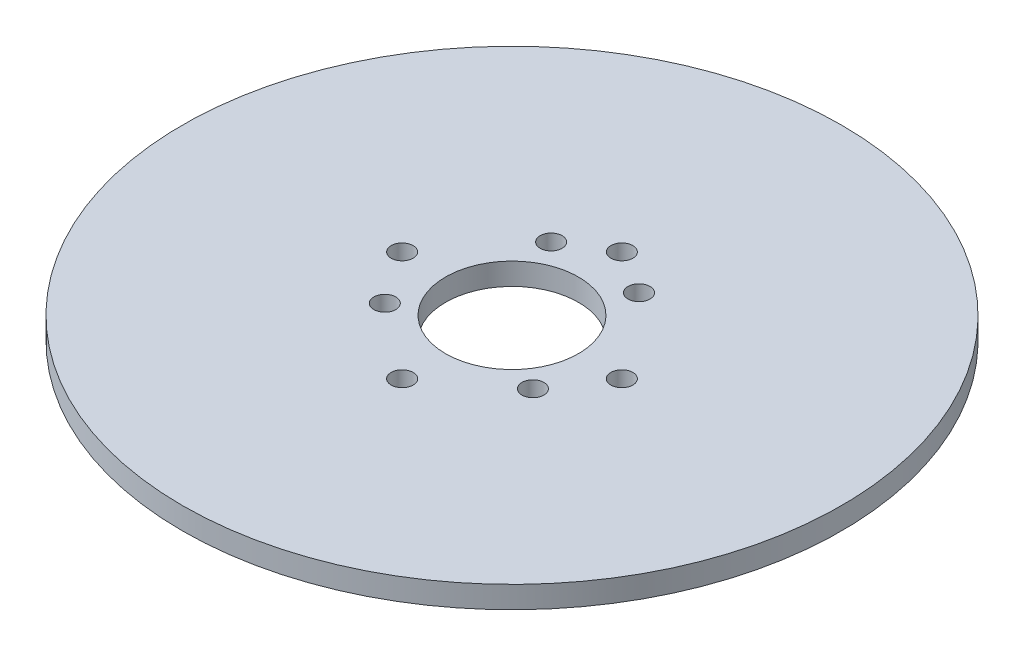
ISO-10303-21;
HEADER;
FILE_DESCRIPTION(('STEP AP214'),'2;1');
FILE_NAME('part.step','',(''),(''),'','','');
FILE_SCHEMA(('AUTOMOTIVE_DESIGN { 1 0 10303 214 1 1 1 1 }'));
ENDSEC;
DATA;
#1=APPLICATION_CONTEXT('core data for automotive mechanical design processes');
#2=APPLICATION_PROTOCOL_DEFINITION('international standard','automotive_design',2000,#1);
#3=PRODUCT_CONTEXT('',#1,'mechanical');
#4=PRODUCT('Part','Part','',(#3));
#5=PRODUCT_RELATED_PRODUCT_CATEGORY('part','',(#4));
#6=PRODUCT_DEFINITION_FORMATION('','',#4);
#7=PRODUCT_DEFINITION_CONTEXT('part definition',#1,'design');
#8=PRODUCT_DEFINITION('design','',#6,#7);
#9=PRODUCT_DEFINITION_SHAPE('','',#8);
#10=(LENGTH_UNIT() NAMED_UNIT(*) SI_UNIT(.MILLI.,.METRE.));
#11=(NAMED_UNIT(*) PLANE_ANGLE_UNIT() SI_UNIT($,.RADIAN.));
#12=(NAMED_UNIT(*) SI_UNIT($,.STERADIAN.) SOLID_ANGLE_UNIT());
#13=UNCERTAINTY_MEASURE_WITH_UNIT(LENGTH_MEASURE(1.E-05),#10,'distance_accuracy_value','');
#14=(GEOMETRIC_REPRESENTATION_CONTEXT(3) GLOBAL_UNCERTAINTY_ASSIGNED_CONTEXT((#13)) GLOBAL_UNIT_ASSIGNED_CONTEXT((#10,
#11,#12)) REPRESENTATION_CONTEXT('',''));
#15=CARTESIAN_POINT('',(0.,0.,0.));
#16=DIRECTION('',(0.,0.,1.));
#17=DIRECTION('',(1.,0.,0.));
#18=AXIS2_PLACEMENT_3D('',#15,#16,#17);
#19=CARTESIAN_POINT('',(-50.,10.,-2.49999999999999));
#20=DIRECTION('',(0.,-1.,0.));
#21=DIRECTION('',(0.,0.,-1.));
#22=AXIS2_PLACEMENT_3D('',#19,#20,#21);
#23=CYLINDRICAL_SURFACE('',#22,5.);
#24=CARTESIAN_POINT('',(-50.,10.,-2.49999999999999));
#25=DIRECTION('',(0.,1.,0.));
#26=DIRECTION('',(0.,0.,1.));
#27=AXIS2_PLACEMENT_3D('',#24,#25,#26);
#28=CIRCLE('',#27,5.);
#29=CARTESIAN_POINT('',(-50.,10.,2.50000000000001));
#30=VERTEX_POINT('',#29);
#31=EDGE_CURVE('E41',#30,#30,#28,.T.);
#32=ORIENTED_EDGE('',*,*,#31,.T.);
#33=EDGE_LOOP('',(#32));
#34=FACE_BOUND('',#33,.T.);
#35=CARTESIAN_POINT('',(-50.,0.,-2.49999999999999));
#36=DIRECTION('',(0.,1.,0.));
#37=DIRECTION('',(0.,0.,1.));
#38=AXIS2_PLACEMENT_3D('',#35,#36,#37);
#39=CIRCLE('',#38,5.);
#40=CARTESIAN_POINT('',(-50.,0.,2.50000000000001));
#41=VERTEX_POINT('',#40);
#42=EDGE_CURVE('E73',#41,#41,#39,.T.);
#43=ORIENTED_EDGE('',*,*,#42,.F.);
#44=EDGE_LOOP('',(#43));
#45=FACE_BOUND('',#44,.T.);
#46=ADVANCED_FACE('F33',(#34,#45),#23,.F.);
#47=CARTESIAN_POINT('',(0.,10.,47.5));
#48=DIRECTION('',(0.,-1.,0.));
#49=DIRECTION('',(0.,0.,-1.));
#50=AXIS2_PLACEMENT_3D('',#47,#48,#49);
#51=CYLINDRICAL_SURFACE('',#50,5.);
#52=CARTESIAN_POINT('',(0.,10.,47.5));
#53=DIRECTION('',(0.,1.,0.));
#54=DIRECTION('',(0.,0.,1.));
#55=AXIS2_PLACEMENT_3D('',#52,#53,#54);
#56=CIRCLE('',#55,5.);
#57=CARTESIAN_POINT('',(0.,10.,52.5));
#58=VERTEX_POINT('',#57);
#59=EDGE_CURVE('E46',#58,#58,#56,.T.);
#60=ORIENTED_EDGE('',*,*,#59,.T.);
#61=EDGE_LOOP('',(#60));
#62=FACE_BOUND('',#61,.T.);
#63=CARTESIAN_POINT('',(0.,0.,47.5));
#64=DIRECTION('',(0.,1.,0.));
#65=DIRECTION('',(0.,0.,1.));
#66=AXIS2_PLACEMENT_3D('',#63,#64,#65);
#67=CIRCLE('',#66,5.);
#68=CARTESIAN_POINT('',(0.,0.,52.5));
#69=VERTEX_POINT('',#68);
#70=EDGE_CURVE('E71',#69,#69,#67,.T.);
#71=ORIENTED_EDGE('',*,*,#70,.F.);
#72=EDGE_LOOP('',(#71));
#73=FACE_BOUND('',#72,.T.);
#74=ADVANCED_FACE('F106',(#62,#73),#51,.F.);
#75=CARTESIAN_POINT('',(50.,10.,-2.5));
#76=DIRECTION('',(0.,-1.,0.));
#77=DIRECTION('',(0.,0.,-1.));
#78=AXIS2_PLACEMENT_3D('',#75,#76,#77);
#79=CYLINDRICAL_SURFACE('',#78,5.);
#80=CARTESIAN_POINT('',(50.,10.,-2.5));
#81=DIRECTION('',(0.,1.,0.));
#82=DIRECTION('',(0.,0.,1.));
#83=AXIS2_PLACEMENT_3D('',#80,#81,#82);
#84=CIRCLE('',#83,5.);
#85=CARTESIAN_POINT('',(50.,10.,2.49999999999999));
#86=VERTEX_POINT('',#85);
#87=EDGE_CURVE('E101',#86,#86,#84,.T.);
#88=ORIENTED_EDGE('',*,*,#87,.T.);
#89=EDGE_LOOP('',(#88));
#90=FACE_BOUND('',#89,.T.);
#91=CARTESIAN_POINT('',(50.,0.,-2.5));
#92=DIRECTION('',(0.,1.,0.));
#93=DIRECTION('',(0.,0.,1.));
#94=AXIS2_PLACEMENT_3D('',#91,#92,#93);
#95=CIRCLE('',#94,5.);
#96=CARTESIAN_POINT('',(50.,0.,2.49999999999999));
#97=VERTEX_POINT('',#96);
#98=EDGE_CURVE('E68',#97,#97,#95,.T.);
#99=ORIENTED_EDGE('',*,*,#98,.F.);
#100=EDGE_LOOP('',(#99));
#101=FACE_BOUND('',#100,.T.);
#102=ADVANCED_FACE('F124',(#90,#101),#79,.F.);
#103=CARTESIAN_POINT('',(0.,10.,-52.5));
#104=DIRECTION('',(0.,-1.,0.));
#105=DIRECTION('',(0.,0.,-1.));
#106=AXIS2_PLACEMENT_3D('',#103,#104,#105);
#107=CYLINDRICAL_SURFACE('',#106,5.);
#108=CARTESIAN_POINT('',(0.,10.,-52.5));
#109=DIRECTION('',(0.,1.,0.));
#110=DIRECTION('',(0.,0.,1.));
#111=AXIS2_PLACEMENT_3D('',#108,#109,#110);
#112=CIRCLE('',#111,5.);
#113=CARTESIAN_POINT('',(0.,10.,-47.5));
#114=VERTEX_POINT('',#113);
#115=EDGE_CURVE('E98',#114,#114,#112,.T.);
#116=ORIENTED_EDGE('',*,*,#115,.T.);
#117=EDGE_LOOP('',(#116));
#118=FACE_BOUND('',#117,.T.);
#119=CARTESIAN_POINT('',(0.,0.,-52.5));
#120=DIRECTION('',(0.,1.,0.));
#121=DIRECTION('',(0.,0.,1.));
#122=AXIS2_PLACEMENT_3D('',#119,#120,#121);
#123=CIRCLE('',#122,5.);
#124=CARTESIAN_POINT('',(0.,0.,-47.5));
#125=VERTEX_POINT('',#124);
#126=EDGE_CURVE('E65',#125,#125,#123,.T.);
#127=ORIENTED_EDGE('',*,*,#126,.F.);
#128=EDGE_LOOP('',(#127));
#129=FACE_BOUND('',#128,.T.);
#130=ADVANCED_FACE('F131',(#118,#129),#107,.F.);
#131=CARTESIAN_POINT('',(0.,10.,-2.5));
#132=DIRECTION('',(0.,-1.,0.));
#133=DIRECTION('',(0.,0.,-1.));
#134=AXIS2_PLACEMENT_3D('',#131,#132,#133);
#135=CYLINDRICAL_SURFACE('',#134,30.25);
#136=CARTESIAN_POINT('',(0.,10.,-2.5));
#137=DIRECTION('',(0.,1.,0.));
#138=DIRECTION('',(0.,0.,1.));
#139=AXIS2_PLACEMENT_3D('',#136,#137,#138);
#140=CIRCLE('',#139,30.25);
#141=CARTESIAN_POINT('',(0.,10.,27.75));
#142=VERTEX_POINT('',#141);
#143=EDGE_CURVE('E95',#142,#142,#140,.T.);
#144=ORIENTED_EDGE('',*,*,#143,.T.);
#145=EDGE_LOOP('',(#144));
#146=FACE_BOUND('',#145,.T.);
#147=CARTESIAN_POINT('',(0.,0.,-2.5));
#148=DIRECTION('',(0.,1.,0.));
#149=DIRECTION('',(0.,0.,1.));
#150=AXIS2_PLACEMENT_3D('',#147,#148,#149);
#151=CIRCLE('',#150,30.25);
#152=CARTESIAN_POINT('',(0.,0.,27.75));
#153=VERTEX_POINT('',#152);
#154=EDGE_CURVE('E62',#153,#153,#151,.T.);
#155=ORIENTED_EDGE('',*,*,#154,.F.);
#156=EDGE_LOOP('',(#155));
#157=FACE_BOUND('',#156,.T.);
#158=ADVANCED_FACE('F135',(#146,#157),#135,.F.);
#159=CARTESIAN_POINT('',(-33.7,10.,21.6932272230723));
#160=DIRECTION('',(0.,-1.,0.));
#161=DIRECTION('',(0.,0.,-1.));
#162=AXIS2_PLACEMENT_3D('',#159,#160,#161);
#163=CYLINDRICAL_SURFACE('',#162,4.99999999999998);
#164=CARTESIAN_POINT('',(-33.7,10.,21.6932272230723));
#165=DIRECTION('',(0.,1.,0.));
#166=DIRECTION('',(0.,0.,1.));
#167=AXIS2_PLACEMENT_3D('',#164,#165,#166);
#168=CIRCLE('',#167,4.99999999999998);
#169=CARTESIAN_POINT('',(-33.7,10.,26.6932272230723));
#170=VERTEX_POINT('',#169);
#171=EDGE_CURVE('E92',#170,#170,#168,.T.);
#172=ORIENTED_EDGE('',*,*,#171,.T.);
#173=EDGE_LOOP('',(#172));
#174=FACE_BOUND('',#173,.T.);
#175=CARTESIAN_POINT('',(-33.7,0.,21.6932272230723));
#176=DIRECTION('',(0.,1.,0.));
#177=DIRECTION('',(0.,0.,1.));
#178=AXIS2_PLACEMENT_3D('',#175,#176,#177);
#179=CIRCLE('',#178,4.99999999999998);
#180=CARTESIAN_POINT('',(-33.7,0.,26.6932272230723));
#181=VERTEX_POINT('',#180);
#182=EDGE_CURVE('E59',#181,#181,#179,.T.);
#183=ORIENTED_EDGE('',*,*,#182,.F.);
#184=EDGE_LOOP('',(#183));
#185=FACE_BOUND('',#184,.T.);
#186=ADVANCED_FACE('F139',(#174,#185),#163,.F.);
#187=CARTESIAN_POINT('',(33.7,10.,21.6932272230723));
#188=DIRECTION('',(0.,-1.,0.));
#189=DIRECTION('',(0.,0.,-1.));
#190=AXIS2_PLACEMENT_3D('',#187,#188,#189);
#191=CYLINDRICAL_SURFACE('',#190,4.99999999999999);
#192=CARTESIAN_POINT('',(33.7,10.,21.6932272230723));
#193=DIRECTION('',(0.,1.,0.));
#194=DIRECTION('',(0.,0.,1.));
#195=AXIS2_PLACEMENT_3D('',#192,#193,#194);
#196=CIRCLE('',#195,4.99999999999999);
#197=CARTESIAN_POINT('',(33.7,10.,26.6932272230723));
#198=VERTEX_POINT('',#197);
#199=EDGE_CURVE('E87',#198,#198,#196,.T.);
#200=ORIENTED_EDGE('',*,*,#199,.T.);
#201=EDGE_LOOP('',(#200));
#202=FACE_BOUND('',#201,.T.);
#203=CARTESIAN_POINT('',(33.7,0.,21.6932272230723));
#204=DIRECTION('',(0.,1.,0.));
#205=DIRECTION('',(0.,0.,1.));
#206=AXIS2_PLACEMENT_3D('',#203,#204,#205);
#207=CIRCLE('',#206,4.99999999999999);
#208=CARTESIAN_POINT('',(33.7,0.,26.6932272230723));
#209=VERTEX_POINT('',#208);
#210=EDGE_CURVE('E56',#209,#209,#207,.T.);
#211=ORIENTED_EDGE('',*,*,#210,.F.);
#212=EDGE_LOOP('',(#211));
#213=FACE_BOUND('',#212,.T.);
#214=ADVANCED_FACE('F143',(#202,#213),#191,.F.);
#215=CARTESIAN_POINT('',(20.,10.,-40.3112887414928));
#216=DIRECTION('',(0.,-1.,0.));
#217=DIRECTION('',(0.,0.,-1.));
#218=AXIS2_PLACEMENT_3D('',#215,#216,#217);
#219=CYLINDRICAL_SURFACE('',#218,5.);
#220=CARTESIAN_POINT('',(20.,10.,-40.3112887414928));
#221=DIRECTION('',(0.,1.,0.));
#222=DIRECTION('',(0.,0.,1.));
#223=AXIS2_PLACEMENT_3D('',#220,#221,#222);
#224=CIRCLE('',#223,5.);
#225=CARTESIAN_POINT('',(20.,10.,-35.3112887414928));
#226=VERTEX_POINT('',#225);
#227=EDGE_CURVE('E82',#226,#226,#224,.T.);
#228=ORIENTED_EDGE('',*,*,#227,.T.);
#229=EDGE_LOOP('',(#228));
#230=FACE_BOUND('',#229,.T.);
#231=CARTESIAN_POINT('',(20.,0.,-40.3112887414928));
#232=DIRECTION('',(0.,1.,0.));
#233=DIRECTION('',(0.,0.,1.));
#234=AXIS2_PLACEMENT_3D('',#231,#232,#233);
#235=CIRCLE('',#234,5.);
#236=CARTESIAN_POINT('',(20.,0.,-35.3112887414928));
#237=VERTEX_POINT('',#236);
#238=EDGE_CURVE('E53',#237,#237,#235,.T.);
#239=ORIENTED_EDGE('',*,*,#238,.F.);
#240=EDGE_LOOP('',(#239));
#241=FACE_BOUND('',#240,.T.);
#242=ADVANCED_FACE('F146',(#230,#241),#219,.F.);
#243=CARTESIAN_POINT('',(-20.,10.,-40.3112887414928));
#244=DIRECTION('',(0.,-1.,0.));
#245=DIRECTION('',(0.,0.,-1.));
#246=AXIS2_PLACEMENT_3D('',#243,#244,#245);
#247=CYLINDRICAL_SURFACE('',#246,4.99999999999999);
#248=CARTESIAN_POINT('',(-20.,10.,-40.3112887414928));
#249=DIRECTION('',(0.,1.,0.));
#250=DIRECTION('',(0.,0.,1.));
#251=AXIS2_PLACEMENT_3D('',#248,#249,#250);
#252=CIRCLE('',#251,4.99999999999999);
#253=CARTESIAN_POINT('',(-20.,10.,-35.3112887414928));
#254=VERTEX_POINT('',#253);
#255=EDGE_CURVE('E78',#254,#254,#252,.T.);
#256=ORIENTED_EDGE('',*,*,#255,.T.);
#257=EDGE_LOOP('',(#256));
#258=FACE_BOUND('',#257,.T.);
#259=CARTESIAN_POINT('',(-20.,0.,-40.3112887414928));
#260=DIRECTION('',(0.,1.,0.));
#261=DIRECTION('',(0.,0.,1.));
#262=AXIS2_PLACEMENT_3D('',#259,#260,#261);
#263=CIRCLE('',#262,4.99999999999999);
#264=CARTESIAN_POINT('',(-20.,0.,-35.3112887414928));
#265=VERTEX_POINT('',#264);
#266=EDGE_CURVE('E50',#265,#265,#263,.T.);
#267=ORIENTED_EDGE('',*,*,#266,.F.);
#268=EDGE_LOOP('',(#267));
#269=FACE_BOUND('',#268,.T.);
#270=ADVANCED_FACE('F35',(#258,#269),#247,.F.);
#271=CARTESIAN_POINT('',(0.,10.,-2.5));
#272=DIRECTION('',(0.,-1.,0.));
#273=DIRECTION('',(0.,0.,-1.));
#274=AXIS2_PLACEMENT_3D('',#271,#272,#273);
#275=CYLINDRICAL_SURFACE('',#274,150.);
#276=CARTESIAN_POINT('',(0.,10.,-2.5));
#277=DIRECTION('',(0.,1.,0.));
#278=DIRECTION('',(0.,0.,1.));
#279=AXIS2_PLACEMENT_3D('',#276,#277,#278);
#280=CIRCLE('',#279,150.);
#281=CARTESIAN_POINT('',(0.,10.,147.5));
#282=VERTEX_POINT('',#281);
#283=EDGE_CURVE('E10',#282,#282,#280,.T.);
#284=ORIENTED_EDGE('',*,*,#283,.F.);
#285=EDGE_LOOP('',(#284));
#286=FACE_BOUND('',#285,.T.);
#287=CARTESIAN_POINT('',(0.,0.,-2.5));
#288=DIRECTION('',(0.,1.,0.));
#289=DIRECTION('',(0.,0.,1.));
#290=AXIS2_PLACEMENT_3D('',#287,#288,#289);
#291=CIRCLE('',#290,150.);
#292=CARTESIAN_POINT('',(0.,0.,147.5));
#293=VERTEX_POINT('',#292);
#294=EDGE_CURVE('E37',#293,#293,#291,.T.);
#295=ORIENTED_EDGE('',*,*,#294,.T.);
#296=EDGE_LOOP('',(#295));
#297=FACE_BOUND('',#296,.T.);
#298=ADVANCED_FACE('F113',(#286,#297),#275,.T.);
#299=CARTESIAN_POINT('',(0.,10.,0.));
#300=DIRECTION('',(0.,1.,0.));
#301=DIRECTION('',(0.,0.,1.));
#302=AXIS2_PLACEMENT_3D('',#299,#300,#301);
#303=PLANE('',#302);
#304=ORIENTED_EDGE('',*,*,#255,.F.);
#305=EDGE_LOOP('',(#304));
#306=FACE_BOUND('',#305,.T.);
#307=ORIENTED_EDGE('',*,*,#227,.F.);
#308=EDGE_LOOP('',(#307));
#309=FACE_BOUND('',#308,.T.);
#310=ORIENTED_EDGE('',*,*,#199,.F.);
#311=EDGE_LOOP('',(#310));
#312=FACE_BOUND('',#311,.T.);
#313=ORIENTED_EDGE('',*,*,#171,.F.);
#314=EDGE_LOOP('',(#313));
#315=FACE_BOUND('',#314,.T.);
#316=ORIENTED_EDGE('',*,*,#143,.F.);
#317=EDGE_LOOP('',(#316));
#318=FACE_BOUND('',#317,.T.);
#319=ORIENTED_EDGE('',*,*,#115,.F.);
#320=EDGE_LOOP('',(#319));
#321=FACE_BOUND('',#320,.T.);
#322=ORIENTED_EDGE('',*,*,#87,.F.);
#323=EDGE_LOOP('',(#322));
#324=FACE_BOUND('',#323,.T.);
#325=ORIENTED_EDGE('',*,*,#59,.F.);
#326=EDGE_LOOP('',(#325));
#327=FACE_BOUND('',#326,.T.);
#328=ORIENTED_EDGE('',*,*,#31,.F.);
#329=EDGE_LOOP('',(#328));
#330=FACE_BOUND('',#329,.T.);
#331=ORIENTED_EDGE('',*,*,#283,.T.);
#332=EDGE_LOOP('',(#331));
#333=FACE_BOUND('',#332,.T.);
#334=ADVANCED_FACE('F109',(#306,#309,#312,#315,#318,#321,#324,#327,#330,#333),#303,.T.);
#335=CARTESIAN_POINT('',(0.,0.,0.));
#336=DIRECTION('',(0.,1.,0.));
#337=DIRECTION('',(0.,0.,1.));
#338=AXIS2_PLACEMENT_3D('',#335,#336,#337);
#339=PLANE('',#338);
#340=ORIENTED_EDGE('',*,*,#266,.T.);
#341=EDGE_LOOP('',(#340));
#342=FACE_BOUND('',#341,.T.);
#343=ORIENTED_EDGE('',*,*,#238,.T.);
#344=EDGE_LOOP('',(#343));
#345=FACE_BOUND('',#344,.T.);
#346=ORIENTED_EDGE('',*,*,#210,.T.);
#347=EDGE_LOOP('',(#346));
#348=FACE_BOUND('',#347,.T.);
#349=ORIENTED_EDGE('',*,*,#182,.T.);
#350=EDGE_LOOP('',(#349));
#351=FACE_BOUND('',#350,.T.);
#352=ORIENTED_EDGE('',*,*,#154,.T.);
#353=EDGE_LOOP('',(#352));
#354=FACE_BOUND('',#353,.T.);
#355=ORIENTED_EDGE('',*,*,#126,.T.);
#356=EDGE_LOOP('',(#355));
#357=FACE_BOUND('',#356,.T.);
#358=ORIENTED_EDGE('',*,*,#98,.T.);
#359=EDGE_LOOP('',(#358));
#360=FACE_BOUND('',#359,.T.);
#361=ORIENTED_EDGE('',*,*,#70,.T.);
#362=EDGE_LOOP('',(#361));
#363=FACE_BOUND('',#362,.T.);
#364=ORIENTED_EDGE('',*,*,#42,.T.);
#365=EDGE_LOOP('',(#364));
#366=FACE_BOUND('',#365,.T.);
#367=ORIENTED_EDGE('',*,*,#294,.F.);
#368=EDGE_LOOP('',(#367));
#369=FACE_BOUND('',#368,.T.);
#370=ADVANCED_FACE('F112',(#342,#345,#348,#351,#354,#357,#360,#363,#366,#369),#339,.F.);
#371=CLOSED_SHELL('',(#46,#74,#102,#130,#158,#186,#214,#242,#270,#298,#334,#370));
#372=MANIFOLD_SOLID_BREP('B2',#371);
#373=ADVANCED_BREP_SHAPE_REPRESENTATION('',(#18,#372),#14);
#374=SHAPE_DEFINITION_REPRESENTATION(#9,#373);
ENDSEC;
END-ISO-10303-21;
